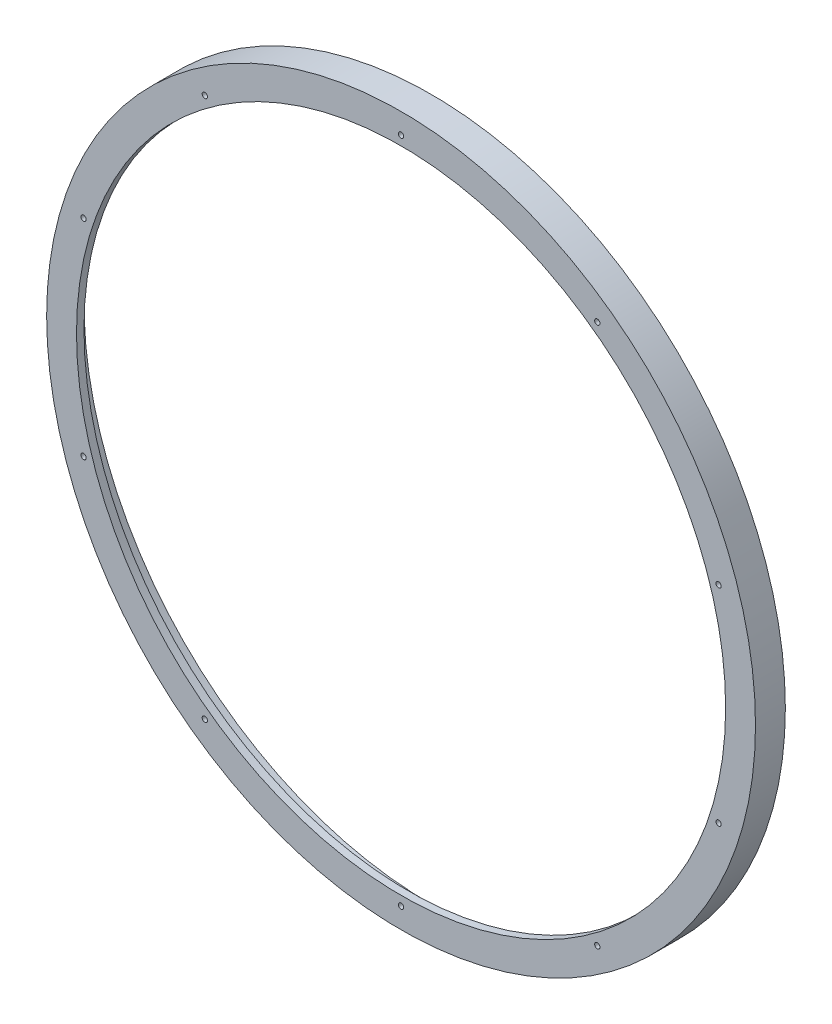
ISO-10303-21;
HEADER;
FILE_DESCRIPTION(('STEP AP214'),'2;1');
FILE_NAME('part.step','',(''),(''),'','','');
FILE_SCHEMA(('AUTOMOTIVE_DESIGN { 1 0 10303 214 1 1 1 1 }'));
ENDSEC;
DATA;
#1=APPLICATION_CONTEXT('core data for automotive mechanical design processes');
#2=APPLICATION_PROTOCOL_DEFINITION('international standard','automotive_design',2000,#1);
#3=PRODUCT_CONTEXT('',#1,'mechanical');
#4=PRODUCT('Part','Part','',(#3));
#5=PRODUCT_RELATED_PRODUCT_CATEGORY('part','',(#4));
#6=PRODUCT_DEFINITION_FORMATION('','',#4);
#7=PRODUCT_DEFINITION_CONTEXT('part definition',#1,'design');
#8=PRODUCT_DEFINITION('design','',#6,#7);
#9=PRODUCT_DEFINITION_SHAPE('','',#8);
#10=(LENGTH_UNIT() NAMED_UNIT(*) SI_UNIT(.MILLI.,.METRE.));
#11=(NAMED_UNIT(*) PLANE_ANGLE_UNIT() SI_UNIT($,.RADIAN.));
#12=(NAMED_UNIT(*) SI_UNIT($,.STERADIAN.) SOLID_ANGLE_UNIT());
#13=UNCERTAINTY_MEASURE_WITH_UNIT(LENGTH_MEASURE(1.E-05),#10,'distance_accuracy_value','');
#14=(GEOMETRIC_REPRESENTATION_CONTEXT(3) GLOBAL_UNCERTAINTY_ASSIGNED_CONTEXT((#13)) GLOBAL_UNIT_ASSIGNED_CONTEXT((#10,
#11,#12)) REPRESENTATION_CONTEXT('',''));
#15=CARTESIAN_POINT('',(0.,0.,0.));
#16=DIRECTION('',(0.,0.,1.));
#17=DIRECTION('',(1.,0.,0.));
#18=AXIS2_PLACEMENT_3D('',#15,#16,#17);
#19=CARTESIAN_POINT('',(0.,150.749,0.));
#20=DIRECTION('',(0.,0.,-1.));
#21=DIRECTION('',(-1.,0.,0.));
#22=AXIS2_PLACEMENT_3D('',#19,#20,#21);
#23=PLANE('',#22);
#24=CARTESIAN_POINT('',(83.4655058255297,114.880413201244,0.));
#25=DIRECTION('',(0.,0.,1.));
#26=DIRECTION('',(1.,0.,0.));
#27=AXIS2_PLACEMENT_3D('',#24,#25,#26);
#28=CIRCLE('',#27,1.13029999999999);
#29=CARTESIAN_POINT('',(84.5958058255297,114.880413201244,0.));
#30=VERTEX_POINT('',#29);
#31=EDGE_CURVE('E121',#30,#30,#28,.T.);
#32=ORIENTED_EDGE('',*,*,#31,.F.);
#33=EDGE_LOOP('',(#32));
#34=FACE_BOUND('',#33,.T.);
#35=CARTESIAN_POINT('',(135.050025313911,43.8804132012441,0.));
#36=DIRECTION('',(0.,0.,1.));
#37=DIRECTION('',(1.,0.,0.));
#38=AXIS2_PLACEMENT_3D('',#35,#36,#37);
#39=CIRCLE('',#38,1.13029999999997);
#40=CARTESIAN_POINT('',(136.180325313911,43.8804132012441,0.));
#41=VERTEX_POINT('',#40);
#42=EDGE_CURVE('E115',#41,#41,#39,.T.);
#43=ORIENTED_EDGE('',*,*,#42,.F.);
#44=EDGE_LOOP('',(#43));
#45=FACE_BOUND('',#44,.T.);
#46=CARTESIAN_POINT('',(135.050025313912,-43.8804132012412,0.));
#47=DIRECTION('',(0.,0.,1.));
#48=DIRECTION('',(1.,0.,0.));
#49=AXIS2_PLACEMENT_3D('',#46,#47,#48);
#50=CIRCLE('',#49,1.1303);
#51=CARTESIAN_POINT('',(136.180325313912,-43.8804132012412,0.));
#52=VERTEX_POINT('',#51);
#53=EDGE_CURVE('E109',#52,#52,#50,.T.);
#54=ORIENTED_EDGE('',*,*,#53,.F.);
#55=EDGE_LOOP('',(#54));
#56=FACE_BOUND('',#55,.T.);
#57=CARTESIAN_POINT('',(83.4655058255322,-114.880413201242,0.));
#58=DIRECTION('',(0.,0.,1.));
#59=DIRECTION('',(1.,0.,0.));
#60=AXIS2_PLACEMENT_3D('',#57,#58,#59);
#61=CIRCLE('',#60,1.13029999999999);
#62=CARTESIAN_POINT('',(84.5958058255322,-114.880413201242,0.));
#63=VERTEX_POINT('',#62);
#64=EDGE_CURVE('E103',#63,#63,#61,.T.);
#65=ORIENTED_EDGE('',*,*,#64,.F.);
#66=EDGE_LOOP('',(#65));
#67=FACE_BOUND('',#66,.T.);
#68=CARTESIAN_POINT('',(0.,-142.,0.));
#69=DIRECTION('',(0.,0.,1.));
#70=DIRECTION('',(1.,0.,0.));
#71=AXIS2_PLACEMENT_3D('',#68,#69,#70);
#72=CIRCLE('',#71,1.13029999999999);
#73=CARTESIAN_POINT('',(1.13029999999999,-142.,0.));
#74=VERTEX_POINT('',#73);
#75=EDGE_CURVE('E97',#74,#74,#72,.T.);
#76=ORIENTED_EDGE('',*,*,#75,.F.);
#77=EDGE_LOOP('',(#76));
#78=FACE_BOUND('',#77,.T.);
#79=CARTESIAN_POINT('',(-83.4655058255305,-114.880413201243,0.));
#80=DIRECTION('',(0.,0.,1.));
#81=DIRECTION('',(1.,0.,0.));
#82=AXIS2_PLACEMENT_3D('',#79,#80,#81);
#83=CIRCLE('',#82,1.13029999999999);
#84=CARTESIAN_POINT('',(-82.3352058255305,-114.880413201243,0.));
#85=VERTEX_POINT('',#84);
#86=EDGE_CURVE('E91',#85,#85,#83,.T.);
#87=ORIENTED_EDGE('',*,*,#86,.F.);
#88=EDGE_LOOP('',(#87));
#89=FACE_BOUND('',#88,.T.);
#90=CARTESIAN_POINT('',(-135.050025313912,-43.8804132012431,0.));
#91=DIRECTION('',(0.,0.,1.));
#92=DIRECTION('',(1.,0.,0.));
#93=AXIS2_PLACEMENT_3D('',#90,#91,#92);
#94=CIRCLE('',#93,1.13029999999997);
#95=CARTESIAN_POINT('',(-133.919725313912,-43.8804132012431,0.));
#96=VERTEX_POINT('',#95);
#97=EDGE_CURVE('E85',#96,#96,#94,.T.);
#98=ORIENTED_EDGE('',*,*,#97,.F.);
#99=EDGE_LOOP('',(#98));
#100=FACE_BOUND('',#99,.T.);
#101=CARTESIAN_POINT('',(0.,0.,0.));
#102=DIRECTION('',(0.,0.,1.));
#103=DIRECTION('',(1.,0.,0.));
#104=AXIS2_PLACEMENT_3D('',#101,#102,#103);
#105=CIRCLE('',#104,150.749);
#106=CARTESIAN_POINT('',(150.749,0.,0.));
#107=VERTEX_POINT('',#106);
#108=EDGE_CURVE('E49',#107,#107,#105,.T.);
#109=ORIENTED_EDGE('',*,*,#108,.T.);
#110=EDGE_LOOP('',(#109));
#111=FACE_BOUND('',#110,.T.);
#112=CARTESIAN_POINT('',(0.,0.,0.));
#113=DIRECTION('',(0.,0.,1.));
#114=DIRECTION('',(1.,0.,0.));
#115=AXIS2_PLACEMENT_3D('',#112,#113,#114);
#116=CIRCLE('',#115,138.049);
#117=CARTESIAN_POINT('',(138.049,0.,0.));
#118=VERTEX_POINT('',#117);
#119=EDGE_CURVE('E45',#118,#118,#116,.T.);
#120=ORIENTED_EDGE('',*,*,#119,.F.);
#121=EDGE_LOOP('',(#120));
#122=FACE_BOUND('',#121,.T.);
#123=CARTESIAN_POINT('',(0.,142.,0.));
#124=DIRECTION('',(0.,0.,1.));
#125=DIRECTION('',(1.,0.,0.));
#126=AXIS2_PLACEMENT_3D('',#123,#124,#125);
#127=CIRCLE('',#126,1.13029999999999);
#128=CARTESIAN_POINT('',(1.13029999999999,142.,0.));
#129=VERTEX_POINT('',#128);
#130=EDGE_CURVE('E67',#129,#129,#127,.T.);
#131=ORIENTED_EDGE('',*,*,#130,.F.);
#132=EDGE_LOOP('',(#131));
#133=FACE_BOUND('',#132,.T.);
#134=CARTESIAN_POINT('',(-83.4655058255314,114.880413201242,0.));
#135=DIRECTION('',(0.,0.,1.));
#136=DIRECTION('',(1.,0.,0.));
#137=AXIS2_PLACEMENT_3D('',#134,#135,#136);
#138=CIRCLE('',#137,1.13029999999999);
#139=CARTESIAN_POINT('',(-82.3352058255314,114.880413201242,0.));
#140=VERTEX_POINT('',#139);
#141=EDGE_CURVE('E73',#140,#140,#138,.T.);
#142=ORIENTED_EDGE('',*,*,#141,.F.);
#143=EDGE_LOOP('',(#142));
#144=FACE_BOUND('',#143,.T.);
#145=CARTESIAN_POINT('',(-135.050025313912,43.8804132012422,0.));
#146=DIRECTION('',(0.,0.,1.));
#147=DIRECTION('',(1.,0.,0.));
#148=AXIS2_PLACEMENT_3D('',#145,#146,#147);
#149=CIRCLE('',#148,1.1303);
#150=CARTESIAN_POINT('',(-133.919725313912,43.8804132012422,0.));
#151=VERTEX_POINT('',#150);
#152=EDGE_CURVE('E79',#151,#151,#149,.T.);
#153=ORIENTED_EDGE('',*,*,#152,.F.);
#154=EDGE_LOOP('',(#153));
#155=FACE_BOUND('',#154,.T.);
#156=ADVANCED_FACE('F38',(#34,#45,#56,#67,#78,#89,#100,#111,#122,#133,#144,#155),#23,.F.);
#157=CARTESIAN_POINT('',(0.,138.049,-3.175));
#158=DIRECTION('',(0.,0.,1.));
#159=DIRECTION('',(1.,0.,0.));
#160=AXIS2_PLACEMENT_3D('',#157,#158,#159);
#161=PLANE('',#160);
#162=CARTESIAN_POINT('',(83.4655058255297,114.880413201244,-3.175));
#163=DIRECTION('',(0.,0.,1.));
#164=DIRECTION('',(1.,0.,0.));
#165=AXIS2_PLACEMENT_3D('',#162,#163,#164);
#166=CIRCLE('',#165,1.13029999999999);
#167=CARTESIAN_POINT('',(84.5958058255297,114.880413201244,-3.175));
#168=VERTEX_POINT('',#167);
#169=EDGE_CURVE('E118',#168,#168,#166,.T.);
#170=ORIENTED_EDGE('',*,*,#169,.T.);
#171=EDGE_LOOP('',(#170));
#172=FACE_BOUND('',#171,.T.);
#173=CARTESIAN_POINT('',(135.050025313911,43.8804132012441,-3.175));
#174=DIRECTION('',(0.,0.,1.));
#175=DIRECTION('',(1.,0.,0.));
#176=AXIS2_PLACEMENT_3D('',#173,#174,#175);
#177=CIRCLE('',#176,1.13029999999999);
#178=CARTESIAN_POINT('',(136.180325313911,43.8804132012441,-3.175));
#179=VERTEX_POINT('',#178);
#180=EDGE_CURVE('E112',#179,#179,#177,.T.);
#181=ORIENTED_EDGE('',*,*,#180,.T.);
#182=EDGE_LOOP('',(#181));
#183=FACE_BOUND('',#182,.T.);
#184=CARTESIAN_POINT('',(135.050025313912,-43.8804132012412,-3.175));
#185=DIRECTION('',(0.,0.,1.));
#186=DIRECTION('',(1.,0.,0.));
#187=AXIS2_PLACEMENT_3D('',#184,#185,#186);
#188=CIRCLE('',#187,1.1303);
#189=CARTESIAN_POINT('',(136.180325313912,-43.8804132012412,-3.175));
#190=VERTEX_POINT('',#189);
#191=EDGE_CURVE('E106',#190,#190,#188,.T.);
#192=ORIENTED_EDGE('',*,*,#191,.T.);
#193=EDGE_LOOP('',(#192));
#194=FACE_BOUND('',#193,.T.);
#195=CARTESIAN_POINT('',(83.4655058255322,-114.880413201242,-3.175));
#196=DIRECTION('',(0.,0.,1.));
#197=DIRECTION('',(1.,0.,0.));
#198=AXIS2_PLACEMENT_3D('',#195,#196,#197);
#199=CIRCLE('',#198,1.13029999999999);
#200=CARTESIAN_POINT('',(84.5958058255322,-114.880413201242,-3.175));
#201=VERTEX_POINT('',#200);
#202=EDGE_CURVE('E100',#201,#201,#199,.T.);
#203=ORIENTED_EDGE('',*,*,#202,.T.);
#204=EDGE_LOOP('',(#203));
#205=FACE_BOUND('',#204,.T.);
#206=CARTESIAN_POINT('',(0.,-142.,-3.175));
#207=DIRECTION('',(0.,0.,1.));
#208=DIRECTION('',(1.,0.,0.));
#209=AXIS2_PLACEMENT_3D('',#206,#207,#208);
#210=CIRCLE('',#209,1.13029999999999);
#211=CARTESIAN_POINT('',(1.13029999999999,-142.,-3.175));
#212=VERTEX_POINT('',#211);
#213=EDGE_CURVE('E94',#212,#212,#210,.T.);
#214=ORIENTED_EDGE('',*,*,#213,.T.);
#215=EDGE_LOOP('',(#214));
#216=FACE_BOUND('',#215,.T.);
#217=CARTESIAN_POINT('',(-83.4655058255305,-114.880413201243,-3.175));
#218=DIRECTION('',(0.,0.,1.));
#219=DIRECTION('',(1.,0.,0.));
#220=AXIS2_PLACEMENT_3D('',#217,#218,#219);
#221=CIRCLE('',#220,1.13029999999999);
#222=CARTESIAN_POINT('',(-82.3352058255305,-114.880413201243,-3.175));
#223=VERTEX_POINT('',#222);
#224=EDGE_CURVE('E88',#223,#223,#221,.T.);
#225=ORIENTED_EDGE('',*,*,#224,.T.);
#226=EDGE_LOOP('',(#225));
#227=FACE_BOUND('',#226,.T.);
#228=CARTESIAN_POINT('',(-135.050025313912,-43.8804132012431,-3.175));
#229=DIRECTION('',(0.,0.,1.));
#230=DIRECTION('',(1.,0.,0.));
#231=AXIS2_PLACEMENT_3D('',#228,#229,#230);
#232=CIRCLE('',#231,1.13029999999999);
#233=CARTESIAN_POINT('',(-133.919725313912,-43.8804132012431,-3.175));
#234=VERTEX_POINT('',#233);
#235=EDGE_CURVE('E82',#234,#234,#232,.T.);
#236=ORIENTED_EDGE('',*,*,#235,.T.);
#237=EDGE_LOOP('',(#236));
#238=FACE_BOUND('',#237,.T.);
#239=CARTESIAN_POINT('',(-135.050025313912,43.8804132012422,-3.175));
#240=DIRECTION('',(0.,0.,1.));
#241=DIRECTION('',(1.,0.,0.));
#242=AXIS2_PLACEMENT_3D('',#239,#240,#241);
#243=CIRCLE('',#242,1.1303);
#244=CARTESIAN_POINT('',(-133.919725313912,43.8804132012422,-3.175));
#245=VERTEX_POINT('',#244);
#246=EDGE_CURVE('E76',#245,#245,#243,.T.);
#247=ORIENTED_EDGE('',*,*,#246,.T.);
#248=EDGE_LOOP('',(#247));
#249=FACE_BOUND('',#248,.T.);
#250=CARTESIAN_POINT('',(-83.4655058255314,114.880413201242,-3.175));
#251=DIRECTION('',(0.,0.,1.));
#252=DIRECTION('',(1.,0.,0.));
#253=AXIS2_PLACEMENT_3D('',#250,#251,#252);
#254=CIRCLE('',#253,1.13029999999999);
#255=CARTESIAN_POINT('',(-82.3352058255314,114.880413201242,-3.175));
#256=VERTEX_POINT('',#255);
#257=EDGE_CURVE('E70',#256,#256,#254,.T.);
#258=ORIENTED_EDGE('',*,*,#257,.T.);
#259=EDGE_LOOP('',(#258));
#260=FACE_BOUND('',#259,.T.);
#261=CARTESIAN_POINT('',(0.,142.,-3.175));
#262=DIRECTION('',(0.,0.,1.));
#263=DIRECTION('',(1.,0.,0.));
#264=AXIS2_PLACEMENT_3D('',#261,#262,#263);
#265=CIRCLE('',#264,1.13029999999999);
#266=CARTESIAN_POINT('',(1.13029999999999,142.,-3.175));
#267=VERTEX_POINT('',#266);
#268=EDGE_CURVE('E64',#267,#267,#265,.T.);
#269=ORIENTED_EDGE('',*,*,#268,.T.);
#270=EDGE_LOOP('',(#269));
#271=FACE_BOUND('',#270,.T.);
#272=CARTESIAN_POINT('',(0.,0.,-3.175));
#273=DIRECTION('',(0.,0.,1.));
#274=DIRECTION('',(1.,0.,0.));
#275=AXIS2_PLACEMENT_3D('',#272,#273,#274);
#276=CIRCLE('',#275,147.574);
#277=CARTESIAN_POINT('',(147.574,0.,-3.175));
#278=VERTEX_POINT('',#277);
#279=EDGE_CURVE('E61',#278,#278,#276,.T.);
#280=ORIENTED_EDGE('',*,*,#279,.F.);
#281=EDGE_LOOP('',(#280));
#282=FACE_BOUND('',#281,.T.);
#283=CARTESIAN_POINT('',(0.,0.,-3.175));
#284=DIRECTION('',(0.,0.,1.));
#285=DIRECTION('',(1.,0.,0.));
#286=AXIS2_PLACEMENT_3D('',#283,#284,#285);
#287=CIRCLE('',#286,138.049);
#288=CARTESIAN_POINT('',(138.049,0.,-3.175));
#289=VERTEX_POINT('',#288);
#290=EDGE_CURVE('E10',#289,#289,#287,.T.);
#291=ORIENTED_EDGE('',*,*,#290,.T.);
#292=EDGE_LOOP('',(#291));
#293=FACE_BOUND('',#292,.T.);
#294=ADVANCED_FACE('F40',(#172,#183,#194,#205,#216,#227,#238,#249,#260,#271,#282,#293),#161,.F.);
#295=CARTESIAN_POINT('',(0.,0.,0.));
#296=DIRECTION('',(0.,0.,1.));
#297=DIRECTION('',(1.,0.,0.));
#298=AXIS2_PLACEMENT_3D('',#295,#296,#297);
#299=CYLINDRICAL_SURFACE('',#298,138.049);
#300=ORIENTED_EDGE('',*,*,#290,.F.);
#301=EDGE_LOOP('',(#300));
#302=FACE_BOUND('',#301,.T.);
#303=ORIENTED_EDGE('',*,*,#119,.T.);
#304=EDGE_LOOP('',(#303));
#305=FACE_BOUND('',#304,.T.);
#306=ADVANCED_FACE('F162',(#302,#305),#299,.F.);
#307=CARTESIAN_POINT('',(0.,0.,0.));
#308=DIRECTION('',(0.,0.,1.));
#309=DIRECTION('',(1.,0.,0.));
#310=AXIS2_PLACEMENT_3D('',#307,#308,#309);
#311=CYLINDRICAL_SURFACE('',#310,150.749);
#312=ORIENTED_EDGE('',*,*,#108,.F.);
#313=EDGE_LOOP('',(#312));
#314=FACE_BOUND('',#313,.T.);
#315=CARTESIAN_POINT('',(0.,0.,-12.7));
#316=DIRECTION('',(0.,0.,1.));
#317=DIRECTION('',(1.,0.,0.));
#318=AXIS2_PLACEMENT_3D('',#315,#316,#317);
#319=CIRCLE('',#318,150.749);
#320=CARTESIAN_POINT('',(150.749,0.,-12.7));
#321=VERTEX_POINT('',#320);
#322=EDGE_CURVE('E53',#321,#321,#319,.T.);
#323=ORIENTED_EDGE('',*,*,#322,.T.);
#324=EDGE_LOOP('',(#323));
#325=FACE_BOUND('',#324,.T.);
#326=ADVANCED_FACE('F182',(#314,#325),#311,.T.);
#327=CARTESIAN_POINT('',(0.,147.574,-12.7));
#328=DIRECTION('',(0.,0.,1.));
#329=DIRECTION('',(1.,0.,0.));
#330=AXIS2_PLACEMENT_3D('',#327,#328,#329);
#331=PLANE('',#330);
#332=ORIENTED_EDGE('',*,*,#322,.F.);
#333=EDGE_LOOP('',(#332));
#334=FACE_BOUND('',#333,.T.);
#335=CARTESIAN_POINT('',(0.,0.,-12.7));
#336=DIRECTION('',(0.,0.,1.));
#337=DIRECTION('',(1.,0.,0.));
#338=AXIS2_PLACEMENT_3D('',#335,#336,#337);
#339=CIRCLE('',#338,147.574);
#340=CARTESIAN_POINT('',(147.574,0.,-12.7));
#341=VERTEX_POINT('',#340);
#342=EDGE_CURVE('E58',#341,#341,#339,.T.);
#343=ORIENTED_EDGE('',*,*,#342,.T.);
#344=EDGE_LOOP('',(#343));
#345=FACE_BOUND('',#344,.T.);
#346=ADVANCED_FACE('F173',(#334,#345),#331,.F.);
#347=CARTESIAN_POINT('',(0.,0.,0.));
#348=DIRECTION('',(0.,0.,1.));
#349=DIRECTION('',(1.,0.,0.));
#350=AXIS2_PLACEMENT_3D('',#347,#348,#349);
#351=CYLINDRICAL_SURFACE('',#350,147.574);
#352=ORIENTED_EDGE('',*,*,#342,.F.);
#353=EDGE_LOOP('',(#352));
#354=FACE_BOUND('',#353,.T.);
#355=ORIENTED_EDGE('',*,*,#279,.T.);
#356=EDGE_LOOP('',(#355));
#357=FACE_BOUND('',#356,.T.);
#358=ADVANCED_FACE('F170',(#354,#357),#351,.F.);
#359=CARTESIAN_POINT('',(0.,142.,0.));
#360=DIRECTION('',(0.,0.,1.));
#361=DIRECTION('',(1.,0.,0.));
#362=AXIS2_PLACEMENT_3D('',#359,#360,#361);
#363=CYLINDRICAL_SURFACE('',#362,1.13029999999999);
#364=ORIENTED_EDGE('',*,*,#130,.T.);
#365=EDGE_LOOP('',(#364));
#366=FACE_BOUND('',#365,.T.);
#367=ORIENTED_EDGE('',*,*,#268,.F.);
#368=EDGE_LOOP('',(#367));
#369=FACE_BOUND('',#368,.T.);
#370=ADVANCED_FACE('F172',(#366,#369),#363,.F.);
#371=CARTESIAN_POINT('',(-83.4655058255314,114.880413201242,0.));
#372=DIRECTION('',(0.,0.,1.));
#373=DIRECTION('',(1.,0.,0.));
#374=AXIS2_PLACEMENT_3D('',#371,#372,#373);
#375=CYLINDRICAL_SURFACE('',#374,1.13029999999999);
#376=ORIENTED_EDGE('',*,*,#141,.T.);
#377=EDGE_LOOP('',(#376));
#378=FACE_BOUND('',#377,.T.);
#379=ORIENTED_EDGE('',*,*,#257,.F.);
#380=EDGE_LOOP('',(#379));
#381=FACE_BOUND('',#380,.T.);
#382=ADVANCED_FACE('F156',(#378,#381),#375,.F.);
#383=CARTESIAN_POINT('',(-135.050025313912,43.8804132012422,0.));
#384=DIRECTION('',(0.,0.,1.));
#385=DIRECTION('',(1.,0.,0.));
#386=AXIS2_PLACEMENT_3D('',#383,#384,#385);
#387=CYLINDRICAL_SURFACE('',#386,1.1303);
#388=ORIENTED_EDGE('',*,*,#152,.T.);
#389=EDGE_LOOP('',(#388));
#390=FACE_BOUND('',#389,.T.);
#391=ORIENTED_EDGE('',*,*,#246,.F.);
#392=EDGE_LOOP('',(#391));
#393=FACE_BOUND('',#392,.T.);
#394=ADVANCED_FACE('F152',(#390,#393),#387,.F.);
#395=CARTESIAN_POINT('',(-135.050025313912,-43.8804132012431,0.));
#396=DIRECTION('',(0.,0.,1.));
#397=DIRECTION('',(1.,0.,0.));
#398=AXIS2_PLACEMENT_3D('',#395,#396,#397);
#399=CYLINDRICAL_SURFACE('',#398,1.13029999999999);
#400=ORIENTED_EDGE('',*,*,#97,.T.);
#401=EDGE_LOOP('',(#400));
#402=FACE_BOUND('',#401,.T.);
#403=ORIENTED_EDGE('',*,*,#235,.F.);
#404=EDGE_LOOP('',(#403));
#405=FACE_BOUND('',#404,.T.);
#406=ADVANCED_FACE('F155',(#402,#405),#399,.F.);
#407=CARTESIAN_POINT('',(-83.4655058255305,-114.880413201243,0.));
#408=DIRECTION('',(0.,0.,1.));
#409=DIRECTION('',(1.,0.,0.));
#410=AXIS2_PLACEMENT_3D('',#407,#408,#409);
#411=CYLINDRICAL_SURFACE('',#410,1.13029999999999);
#412=ORIENTED_EDGE('',*,*,#86,.T.);
#413=EDGE_LOOP('',(#412));
#414=FACE_BOUND('',#413,.T.);
#415=ORIENTED_EDGE('',*,*,#224,.F.);
#416=EDGE_LOOP('',(#415));
#417=FACE_BOUND('',#416,.T.);
#418=ADVANCED_FACE('F257',(#414,#417),#411,.F.);
#419=CARTESIAN_POINT('',(0.,-142.,0.));
#420=DIRECTION('',(0.,0.,1.));
#421=DIRECTION('',(1.,0.,0.));
#422=AXIS2_PLACEMENT_3D('',#419,#420,#421);
#423=CYLINDRICAL_SURFACE('',#422,1.13029999999999);
#424=ORIENTED_EDGE('',*,*,#75,.T.);
#425=EDGE_LOOP('',(#424));
#426=FACE_BOUND('',#425,.T.);
#427=ORIENTED_EDGE('',*,*,#213,.F.);
#428=EDGE_LOOP('',(#427));
#429=FACE_BOUND('',#428,.T.);
#430=ADVANCED_FACE('F269',(#426,#429),#423,.F.);
#431=CARTESIAN_POINT('',(83.4655058255322,-114.880413201242,0.));
#432=DIRECTION('',(0.,0.,1.));
#433=DIRECTION('',(1.,0.,0.));
#434=AXIS2_PLACEMENT_3D('',#431,#432,#433);
#435=CYLINDRICAL_SURFACE('',#434,1.13029999999999);
#436=ORIENTED_EDGE('',*,*,#64,.T.);
#437=EDGE_LOOP('',(#436));
#438=FACE_BOUND('',#437,.T.);
#439=ORIENTED_EDGE('',*,*,#202,.F.);
#440=EDGE_LOOP('',(#439));
#441=FACE_BOUND('',#440,.T.);
#442=ADVANCED_FACE('F281',(#438,#441),#435,.F.);
#443=CARTESIAN_POINT('',(135.050025313912,-43.8804132012412,0.));
#444=DIRECTION('',(0.,0.,1.));
#445=DIRECTION('',(1.,0.,0.));
#446=AXIS2_PLACEMENT_3D('',#443,#444,#445);
#447=CYLINDRICAL_SURFACE('',#446,1.1303);
#448=ORIENTED_EDGE('',*,*,#53,.T.);
#449=EDGE_LOOP('',(#448));
#450=FACE_BOUND('',#449,.T.);
#451=ORIENTED_EDGE('',*,*,#191,.F.);
#452=EDGE_LOOP('',(#451));
#453=FACE_BOUND('',#452,.T.);
#454=ADVANCED_FACE('F293',(#450,#453),#447,.F.);
#455=CARTESIAN_POINT('',(135.050025313911,43.8804132012441,0.));
#456=DIRECTION('',(0.,0.,1.));
#457=DIRECTION('',(1.,0.,0.));
#458=AXIS2_PLACEMENT_3D('',#455,#456,#457);
#459=CYLINDRICAL_SURFACE('',#458,1.13029999999999);
#460=ORIENTED_EDGE('',*,*,#42,.T.);
#461=EDGE_LOOP('',(#460));
#462=FACE_BOUND('',#461,.T.);
#463=ORIENTED_EDGE('',*,*,#180,.F.);
#464=EDGE_LOOP('',(#463));
#465=FACE_BOUND('',#464,.T.);
#466=ADVANCED_FACE('F305',(#462,#465),#459,.F.);
#467=CARTESIAN_POINT('',(83.4655058255297,114.880413201244,0.));
#468=DIRECTION('',(0.,0.,1.));
#469=DIRECTION('',(1.,0.,0.));
#470=AXIS2_PLACEMENT_3D('',#467,#468,#469);
#471=CYLINDRICAL_SURFACE('',#470,1.13029999999999);
#472=ORIENTED_EDGE('',*,*,#31,.T.);
#473=EDGE_LOOP('',(#472));
#474=FACE_BOUND('',#473,.T.);
#475=ORIENTED_EDGE('',*,*,#169,.F.);
#476=EDGE_LOOP('',(#475));
#477=FACE_BOUND('',#476,.T.);
#478=ADVANCED_FACE('F125',(#474,#477),#471,.F.);
#479=CLOSED_SHELL('',(#156,#294,#306,#326,#346,#358,#370,#382,#394,#406,#418,#430,#442,#454,
#466,#478));
#480=MANIFOLD_SOLID_BREP('B2',#479);
#481=ADVANCED_BREP_SHAPE_REPRESENTATION('',(#18,#480),#14);
#482=SHAPE_DEFINITION_REPRESENTATION(#9,#481);
ENDSEC;
END-ISO-10303-21;
